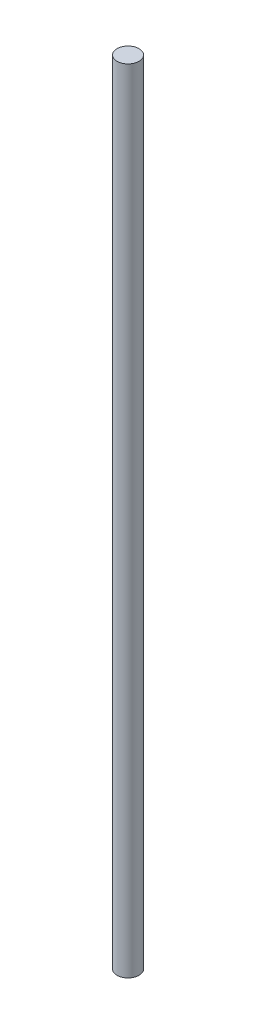
ISO-10303-21;
HEADER;
FILE_DESCRIPTION(('STEP AP214'),'2;1');
FILE_NAME('part.step','',(''),(''),'','','');
FILE_SCHEMA(('AUTOMOTIVE_DESIGN { 1 0 10303 214 1 1 1 1 }'));
ENDSEC;
DATA;
#1=APPLICATION_CONTEXT('core data for automotive mechanical design processes');
#2=APPLICATION_PROTOCOL_DEFINITION('international standard','automotive_design',2000,#1);
#3=PRODUCT_CONTEXT('',#1,'mechanical');
#4=PRODUCT('Part','Part','',(#3));
#5=PRODUCT_RELATED_PRODUCT_CATEGORY('part','',(#4));
#6=PRODUCT_DEFINITION_FORMATION('','',#4);
#7=PRODUCT_DEFINITION_CONTEXT('part definition',#1,'design');
#8=PRODUCT_DEFINITION('design','',#6,#7);
#9=PRODUCT_DEFINITION_SHAPE('','',#8);
#10=(LENGTH_UNIT() NAMED_UNIT(*) SI_UNIT(.MILLI.,.METRE.));
#11=(NAMED_UNIT(*) PLANE_ANGLE_UNIT() SI_UNIT($,.RADIAN.));
#12=(NAMED_UNIT(*) SI_UNIT($,.STERADIAN.) SOLID_ANGLE_UNIT());
#13=UNCERTAINTY_MEASURE_WITH_UNIT(LENGTH_MEASURE(1.E-05),#10,'distance_accuracy_value','');
#14=(GEOMETRIC_REPRESENTATION_CONTEXT(3) GLOBAL_UNCERTAINTY_ASSIGNED_CONTEXT((#13)) GLOBAL_UNIT_ASSIGNED_CONTEXT((#10,
#11,#12)) REPRESENTATION_CONTEXT('',''));
#15=CARTESIAN_POINT('',(0.,0.,0.));
#16=DIRECTION('',(0.,0.,1.));
#17=DIRECTION('',(1.,0.,0.));
#18=AXIS2_PLACEMENT_3D('',#15,#16,#17);
#19=CARTESIAN_POINT('',(0.,180.,0.));
#20=DIRECTION('',(0.,-1.,0.));
#21=DIRECTION('',(0.,0.,-1.));
#22=AXIS2_PLACEMENT_3D('',#19,#20,#21);
#23=CYLINDRICAL_SURFACE('',#22,2.5);
#24=CARTESIAN_POINT('',(0.,180.,0.));
#25=DIRECTION('',(0.,1.,0.));
#26=DIRECTION('',(0.,0.,1.));
#27=AXIS2_PLACEMENT_3D('',#24,#25,#26);
#28=CIRCLE('',#27,2.5);
#29=CARTESIAN_POINT('',(0.,180.,-2.5));
#30=VERTEX_POINT('',#29);
#31=EDGE_CURVE('E10',#30,#30,#28,.T.);
#32=CARTESIAN_POINT('',(0.,0.,0.));
#33=DIRECTION('',(0.,1.,0.));
#34=DIRECTION('',(0.,0.,1.));
#35=AXIS2_PLACEMENT_3D('',#32,#33,#34);
#36=CIRCLE('',#35,2.5);
#37=CARTESIAN_POINT('',(0.,0.,-2.5));
#38=VERTEX_POINT('',#37);
#39=EDGE_CURVE('E34',#38,#38,#36,.T.);
#40=CARTESIAN_POINT('',(0.,180.,-2.5));
#41=CARTESIAN_POINT('',(0.,178.125,-2.5));
#42=CARTESIAN_POINT('',(0.,176.25,-2.5));
#43=CARTESIAN_POINT('',(0.,172.5,-2.5));
#44=CARTESIAN_POINT('',(0.,170.625,-2.5));
#45=CARTESIAN_POINT('',(0.,166.875,-2.5));
#46=CARTESIAN_POINT('',(0.,165.,-2.5));
#47=CARTESIAN_POINT('',(0.,161.25,-2.5));
#48=CARTESIAN_POINT('',(0.,159.375,-2.5));
#49=CARTESIAN_POINT('',(0.,155.625,-2.5));
#50=CARTESIAN_POINT('',(0.,153.75,-2.5));
#51=CARTESIAN_POINT('',(0.,150.,-2.5));
#52=CARTESIAN_POINT('',(0.,148.125,-2.5));
#53=CARTESIAN_POINT('',(0.,144.375,-2.5));
#54=CARTESIAN_POINT('',(0.,142.5,-2.5));
#55=CARTESIAN_POINT('',(0.,138.75,-2.5));
#56=CARTESIAN_POINT('',(0.,136.875,-2.5));
#57=CARTESIAN_POINT('',(0.,133.125,-2.5));
#58=CARTESIAN_POINT('',(0.,131.25,-2.5));
#59=CARTESIAN_POINT('',(0.,127.5,-2.5));
#60=CARTESIAN_POINT('',(0.,125.625,-2.5));
#61=CARTESIAN_POINT('',(0.,121.875,-2.5));
#62=CARTESIAN_POINT('',(0.,120.,-2.5));
#63=CARTESIAN_POINT('',(0.,116.25,-2.5));
#64=CARTESIAN_POINT('',(0.,114.375,-2.5));
#65=CARTESIAN_POINT('',(0.,110.625,-2.5));
#66=CARTESIAN_POINT('',(0.,108.75,-2.5));
#67=CARTESIAN_POINT('',(0.,105.,-2.5));
#68=CARTESIAN_POINT('',(0.,103.125,-2.5));
#69=CARTESIAN_POINT('',(0.,99.375,-2.5));
#70=CARTESIAN_POINT('',(0.,97.5,-2.5));
#71=CARTESIAN_POINT('',(0.,93.75,-2.5));
#72=CARTESIAN_POINT('',(0.,91.875,-2.5));
#73=CARTESIAN_POINT('',(0.,88.125,-2.5));
#74=CARTESIAN_POINT('',(0.,86.25,-2.5));
#75=CARTESIAN_POINT('',(0.,82.5,-2.5));
#76=CARTESIAN_POINT('',(0.,80.625,-2.5));
#77=CARTESIAN_POINT('',(0.,76.875,-2.5));
#78=CARTESIAN_POINT('',(0.,75.,-2.5));
#79=CARTESIAN_POINT('',(0.,71.25,-2.5));
#80=CARTESIAN_POINT('',(0.,69.375,-2.5));
#81=CARTESIAN_POINT('',(0.,65.625,-2.5));
#82=CARTESIAN_POINT('',(0.,63.75,-2.5));
#83=CARTESIAN_POINT('',(0.,60.,-2.5));
#84=CARTESIAN_POINT('',(0.,58.125,-2.5));
#85=CARTESIAN_POINT('',(0.,54.375,-2.5));
#86=CARTESIAN_POINT('',(0.,52.5,-2.5));
#87=CARTESIAN_POINT('',(0.,48.75,-2.5));
#88=CARTESIAN_POINT('',(0.,46.875,-2.5));
#89=CARTESIAN_POINT('',(0.,43.125,-2.5));
#90=CARTESIAN_POINT('',(0.,41.25,-2.5));
#91=CARTESIAN_POINT('',(0.,37.5,-2.5));
#92=CARTESIAN_POINT('',(0.,35.625,-2.5));
#93=CARTESIAN_POINT('',(0.,31.875,-2.5));
#94=CARTESIAN_POINT('',(0.,30.,-2.5));
#95=CARTESIAN_POINT('',(0.,26.25,-2.5));
#96=CARTESIAN_POINT('',(0.,24.375,-2.5));
#97=CARTESIAN_POINT('',(0.,20.625,-2.5));
#98=CARTESIAN_POINT('',(0.,18.75,-2.5));
#99=CARTESIAN_POINT('',(0.,15.,-2.5));
#100=CARTESIAN_POINT('',(0.,13.125,-2.5));
#101=CARTESIAN_POINT('',(0.,9.37499999999998,-2.5));
#102=CARTESIAN_POINT('',(0.,7.49999999999997,-2.5));
#103=CARTESIAN_POINT('',(0.,3.74999999999997,-2.5));
#104=CARTESIAN_POINT('',(0.,1.87499999999997,-2.5));
#105=CARTESIAN_POINT('',(0.,0.,-2.5));
#106=B_SPLINE_CURVE_WITH_KNOTS('',3,(#40,#41,#42,#43,#44,#45,#46,#47,#48,#49,#50,#51,#52,#53,
#54,#55,#56,#57,#58,#59,#60,#61,#62,#63,#64,#65,#66,#67,#68,#69,#70,#71,#72,#73,#74,#75,#76,#77,
#78,#79,#80,#81,#82,#83,#84,#85,#86,#87,#88,#89,#90,#91,#92,#93,#94,#95,#96,#97,#98,#99,#100,
#101,#102,#103,#104,#105),.UNSPECIFIED.,.F.,.F.,(4,2,2,2,2,2,2,2,2,2,2,2,2,2,2,2,2,2,2,2,2,2,2,
2,2,2,2,2,2,2,2,2,4),(0.,5.62499999999999,11.25,16.875,22.5,28.125,33.75,39.375,45.,50.625,
56.25,61.875,67.5,73.125,78.75,84.375,90.,95.625,101.25,106.875,112.5,118.125,123.75,129.375,
135.,140.625,146.25,151.875,157.5,163.125,168.75,174.375,180.),.UNSPECIFIED.);
#107=EDGE_CURVE('BSEAM31',#30,#38,#106,.T.);
#108=ORIENTED_EDGE('',*,*,#31,.F.);
#109=ORIENTED_EDGE('',*,*,#39,.T.);
#110=ORIENTED_EDGE('',*,*,#107,.T.);
#111=ORIENTED_EDGE('',*,*,#107,.F.);
#112=EDGE_LOOP('',(#108,#110,#109,#111));
#113=FACE_BOUND('',#112,.T.);
#114=ADVANCED_FACE('F31',(#113),#23,.T.);
#115=CARTESIAN_POINT('',(0.,180.,0.));
#116=DIRECTION('',(0.,1.,0.));
#117=DIRECTION('',(0.,0.,1.));
#118=AXIS2_PLACEMENT_3D('',#115,#116,#117);
#119=PLANE('',#118);
#120=ORIENTED_EDGE('',*,*,#31,.T.);
#121=EDGE_LOOP('',(#120));
#122=FACE_BOUND('',#121,.T.);
#123=ADVANCED_FACE('F46',(#122),#119,.T.);
#124=CARTESIAN_POINT('',(0.,0.,0.));
#125=DIRECTION('',(0.,1.,0.));
#126=DIRECTION('',(0.,0.,1.));
#127=AXIS2_PLACEMENT_3D('',#124,#125,#126);
#128=PLANE('',#127);
#129=ORIENTED_EDGE('',*,*,#39,.F.);
#130=EDGE_LOOP('',(#129));
#131=FACE_BOUND('',#130,.T.);
#132=ADVANCED_FACE('F44',(#131),#128,.F.);
#133=CLOSED_SHELL('',(#114,#123,#132));
#134=MANIFOLD_SOLID_BREP('B2',#133);
#135=ADVANCED_BREP_SHAPE_REPRESENTATION('',(#18,#134),#14);
#136=SHAPE_DEFINITION_REPRESENTATION(#9,#135);
ENDSEC;
END-ISO-10303-21;
